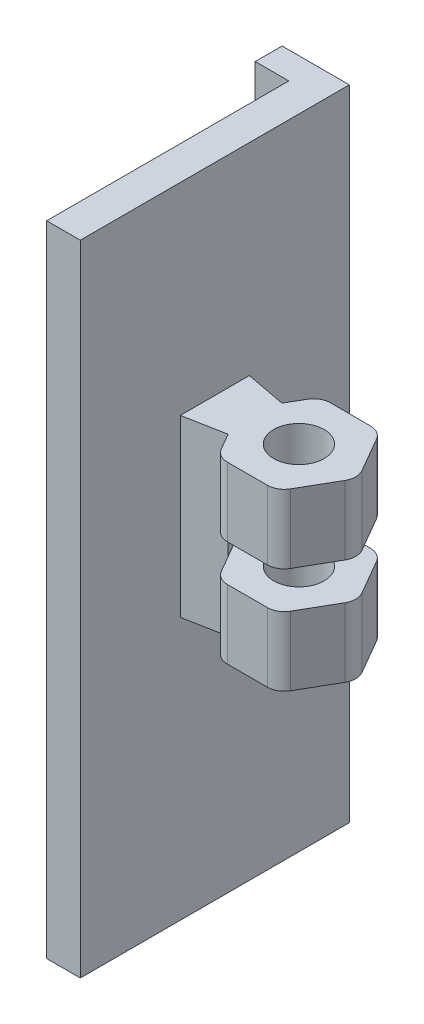
ISO-10303-21;
HEADER;
FILE_DESCRIPTION(('STEP AP214'),'2;1');
FILE_NAME('part.step','',(''),(''),'','','');
FILE_SCHEMA(('AUTOMOTIVE_DESIGN { 1 0 10303 214 1 1 1 1 }'));
ENDSEC;
DATA;
#1=APPLICATION_CONTEXT('core data for automotive mechanical design processes');
#2=APPLICATION_PROTOCOL_DEFINITION('international standard','automotive_design',2000,#1);
#3=PRODUCT_CONTEXT('',#1,'mechanical');
#4=PRODUCT('Part','Part','',(#3));
#5=PRODUCT_RELATED_PRODUCT_CATEGORY('part','',(#4));
#6=PRODUCT_DEFINITION_FORMATION('','',#4);
#7=PRODUCT_DEFINITION_CONTEXT('part definition',#1,'design');
#8=PRODUCT_DEFINITION('design','',#6,#7);
#9=PRODUCT_DEFINITION_SHAPE('','',#8);
#10=(LENGTH_UNIT() NAMED_UNIT(*) SI_UNIT(.MILLI.,.METRE.));
#11=(NAMED_UNIT(*) PLANE_ANGLE_UNIT() SI_UNIT($,.RADIAN.));
#12=(NAMED_UNIT(*) SI_UNIT($,.STERADIAN.) SOLID_ANGLE_UNIT());
#13=UNCERTAINTY_MEASURE_WITH_UNIT(LENGTH_MEASURE(1.E-05),#10,'distance_accuracy_value','');
#14=(GEOMETRIC_REPRESENTATION_CONTEXT(3) GLOBAL_UNCERTAINTY_ASSIGNED_CONTEXT((#13)) GLOBAL_UNIT_ASSIGNED_CONTEXT((#10,
#11,#12)) REPRESENTATION_CONTEXT('',''));
#15=CARTESIAN_POINT('',(0.,0.,0.));
#16=DIRECTION('',(0.,0.,1.));
#17=DIRECTION('',(1.,0.,0.));
#18=AXIS2_PLACEMENT_3D('',#15,#16,#17);
#19=CARTESIAN_POINT('',(2.05832704406993,-7.65,0.765));
#20=DIRECTION('',(0.866025403784441,0.,-0.499999999999996));
#21=DIRECTION('',(-0.499999999999996,0.,-0.866025403784441));
#22=AXIS2_PLACEMENT_3D('',#19,#20,#21);
#23=PLANE('',#22);
#24=DIRECTION('',(0.500000000000008,0.,0.866025403784434));
#25=VECTOR('',#24,1.);
#26=CARTESIAN_POINT('',(2.05832704406993,-8.675,0.765));
#27=LINE('',#26,#25);
#28=CARTESIAN_POINT('',(1.84759419581571,-8.675,0.399999999999999));
#29=VERTEX_POINT('',#28);
#30=CARTESIAN_POINT('',(1.98615826042123,-8.675,0.640000000000003));
#31=VERTEX_POINT('',#30);
#32=EDGE_CURVE('E300',#29,#31,#27,.T.);
#33=ORIENTED_EDGE('',*,*,#32,.T.);
#34=DIRECTION('',(0.,-1.,0.));
#35=VECTOR('',#34,1.);
#36=CARTESIAN_POINT('',(1.98615826042123,-7.65,0.639999999999999));
#37=LINE('',#36,#35);
#38=CARTESIAN_POINT('',(1.98615826042123,-7.65,0.639999999999999));
#39=VERTEX_POINT('',#38);
#40=EDGE_CURVE('E491',#31,#39,#37,.F.);
#41=ORIENTED_EDGE('',*,*,#40,.T.);
#42=DIRECTION('',(0.499999999999996,0.,0.866025403784441));
#43=VECTOR('',#42,1.);
#44=CARTESIAN_POINT('',(2.05832704406993,-7.65,0.765));
#45=LINE('',#44,#43);
#46=CARTESIAN_POINT('',(1.84759419581572,-7.65,0.399999999999996));
#47=VERTEX_POINT('',#46);
#48=EDGE_CURVE('E392',#47,#39,#45,.T.);
#49=ORIENTED_EDGE('',*,*,#48,.F.);
#50=DIRECTION('',(0.,-1.,0.));
#51=VECTOR('',#50,1.);
#52=CARTESIAN_POINT('',(1.84759419581572,-7.65,0.399999999999996));
#53=LINE('',#52,#51);
#54=EDGE_CURVE('E435',#47,#29,#53,.T.);
#55=ORIENTED_EDGE('',*,*,#54,.T.);
#56=EDGE_LOOP('',(#33,#41,#49,#55));
#57=FACE_BOUND('',#56,.T.);
#58=ADVANCED_FACE('F33',(#57),#23,.F.);
#59=CARTESIAN_POINT('',(2.94167295593006,-7.65,0.765000000000004));
#60=DIRECTION('',(0.,0.,-1.));
#61=DIRECTION('',(-1.,0.,0.));
#62=AXIS2_PLACEMENT_3D('',#59,#60,#61);
#63=PLANE('',#62);
#64=DIRECTION('',(1.,0.,0.));
#65=VECTOR('',#64,1.);
#66=CARTESIAN_POINT('',(2.05832704406993,-8.675,0.765));
#67=LINE('',#66,#65);
#68=CARTESIAN_POINT('',(2.20266461136734,-8.675,0.765));
#69=VERTEX_POINT('',#68);
#70=CARTESIAN_POINT('',(2.79733538863265,-8.675,0.765000000000001));
#71=VERTEX_POINT('',#70);
#72=EDGE_CURVE('E304',#69,#71,#67,.T.);
#73=ORIENTED_EDGE('',*,*,#72,.T.);
#74=DIRECTION('',(0.,-1.,0.));
#75=VECTOR('',#74,1.);
#76=CARTESIAN_POINT('',(2.79733538863265,-7.65,0.765000000000003));
#77=LINE('',#76,#75);
#78=CARTESIAN_POINT('',(2.79733538863265,-7.65,0.765000000000003));
#79=VERTEX_POINT('',#78);
#80=EDGE_CURVE('E483',#71,#79,#77,.F.);
#81=ORIENTED_EDGE('',*,*,#80,.T.);
#82=DIRECTION('',(1.,0.,0.));
#83=VECTOR('',#82,1.);
#84=CARTESIAN_POINT('',(2.94167295593006,-7.65,0.765000000000004));
#85=LINE('',#84,#83);
#86=CARTESIAN_POINT('',(2.20266461136734,-7.65,0.765));
#87=VERTEX_POINT('',#86);
#88=EDGE_CURVE('E395',#87,#79,#85,.T.);
#89=ORIENTED_EDGE('',*,*,#88,.F.);
#90=DIRECTION('',(0.,-1.,0.));
#91=VECTOR('',#90,1.);
#92=CARTESIAN_POINT('',(2.20266461136734,-7.65,0.765));
#93=LINE('',#92,#91);
#94=EDGE_CURVE('E488',#87,#69,#93,.T.);
#95=ORIENTED_EDGE('',*,*,#94,.T.);
#96=EDGE_LOOP('',(#73,#81,#89,#95));
#97=FACE_BOUND('',#96,.T.);
#98=ADVANCED_FACE('F583',(#97),#63,.F.);
#99=CARTESIAN_POINT('',(3.38334591186012,-7.65,0.));
#100=DIRECTION('',(-0.866025403784438,0.,-0.500000000000001));
#101=DIRECTION('',(-0.500000000000001,0.,0.866025403784438));
#102=AXIS2_PLACEMENT_3D('',#99,#100,#101);
#103=PLANE('',#102);
#104=DIRECTION('',(0.500000000000002,0.,-0.866025403784438));
#105=VECTOR('',#104,1.);
#106=CARTESIAN_POINT('',(2.94167295593006,-8.675,0.765000000000001));
#107=LINE('',#106,#105);
#108=CARTESIAN_POINT('',(3.01384173957876,-8.675,0.640000000000003));
#109=VERTEX_POINT('',#108);
#110=CARTESIAN_POINT('',(3.31117712821142,-8.675,0.125000000000002));
#111=VERTEX_POINT('',#110);
#112=EDGE_CURVE('E288',#109,#111,#107,.T.);
#113=ORIENTED_EDGE('',*,*,#112,.T.);
#114=DIRECTION('',(0.,-1.,0.));
#115=VECTOR('',#114,1.);
#116=CARTESIAN_POINT('',(3.31117712821142,-7.65,0.125000000000002));
#117=LINE('',#116,#115);
#118=CARTESIAN_POINT('',(3.31117712821142,-7.65,0.125000000000002));
#119=VERTEX_POINT('',#118);
#120=EDGE_CURVE('E502',#111,#119,#117,.F.);
#121=ORIENTED_EDGE('',*,*,#120,.T.);
#122=DIRECTION('',(0.500000000000001,0.,-0.866025403784438));
#123=VECTOR('',#122,1.);
#124=CARTESIAN_POINT('',(3.38334591186012,-7.65,0.));
#125=LINE('',#124,#123);
#126=CARTESIAN_POINT('',(3.01384173957876,-7.65,0.640000000000003));
#127=VERTEX_POINT('',#126);
#128=EDGE_CURVE('E398',#127,#119,#125,.T.);
#129=ORIENTED_EDGE('',*,*,#128,.F.);
#130=DIRECTION('',(0.,-1.,0.));
#131=VECTOR('',#130,1.);
#132=CARTESIAN_POINT('',(3.01384173957876,-7.65,0.640000000000003));
#133=LINE('',#132,#131);
#134=EDGE_CURVE('E507',#127,#109,#133,.T.);
#135=ORIENTED_EDGE('',*,*,#134,.T.);
#136=EDGE_LOOP('',(#113,#121,#129,#135));
#137=FACE_BOUND('',#136,.T.);
#138=ADVANCED_FACE('F575',(#137),#103,.F.);
#139=CARTESIAN_POINT('',(2.94167295593006,-7.65,-0.764999999999999));
#140=DIRECTION('',(-0.866025403784441,0.,0.499999999999996));
#141=DIRECTION('',(0.499999999999996,0.,0.866025403784441));
#142=AXIS2_PLACEMENT_3D('',#139,#140,#141);
#143=PLANE('',#142);
#144=DIRECTION('',(-0.499999999999997,0.,-0.86602540378444));
#145=VECTOR('',#144,1.);
#146=CARTESIAN_POINT('',(3.38334591186012,-8.675,0.));
#147=LINE('',#146,#145);
#148=CARTESIAN_POINT('',(3.31117712821142,-8.675,-0.124999999999997));
#149=VERTEX_POINT('',#148);
#150=CARTESIAN_POINT('',(3.01384173957876,-8.675,-0.639999999999998));
#151=VERTEX_POINT('',#150);
#152=EDGE_CURVE('E291',#149,#151,#147,.T.);
#153=ORIENTED_EDGE('',*,*,#152,.T.);
#154=DIRECTION('',(0.,-1.,0.));
#155=VECTOR('',#154,1.);
#156=CARTESIAN_POINT('',(3.01384173957876,-7.65,-0.639999999999998));
#157=LINE('',#156,#155);
#158=CARTESIAN_POINT('',(3.01384173957876,-7.65,-0.639999999999998));
#159=VERTEX_POINT('',#158);
#160=EDGE_CURVE('E56',#151,#159,#157,.F.);
#161=ORIENTED_EDGE('',*,*,#160,.T.);
#162=DIRECTION('',(-0.499999999999996,0.,-0.866025403784441));
#163=VECTOR('',#162,1.);
#164=CARTESIAN_POINT('',(2.94167295593006,-7.65,-0.764999999999999));
#165=LINE('',#164,#163);
#166=CARTESIAN_POINT('',(3.31117712821142,-7.65,-0.124999999999997));
#167=VERTEX_POINT('',#166);
#168=EDGE_CURVE('E401',#167,#159,#165,.T.);
#169=ORIENTED_EDGE('',*,*,#168,.F.);
#170=DIRECTION('',(0.,-1.,0.));
#171=VECTOR('',#170,1.);
#172=CARTESIAN_POINT('',(3.31117712821142,-7.65,-0.124999999999997));
#173=LINE('',#172,#171);
#174=EDGE_CURVE('E496',#167,#149,#173,.T.);
#175=ORIENTED_EDGE('',*,*,#174,.T.);
#176=EDGE_LOOP('',(#153,#161,#169,#175));
#177=FACE_BOUND('',#176,.T.);
#178=ADVANCED_FACE('F568',(#177),#143,.F.);
#179=CARTESIAN_POINT('',(2.05832704406993,-7.65,-0.765));
#180=DIRECTION('',(0.,0.,1.));
#181=DIRECTION('',(1.,0.,0.));
#182=AXIS2_PLACEMENT_3D('',#179,#180,#181);
#183=PLANE('',#182);
#184=DIRECTION('',(-1.,0.,0.));
#185=VECTOR('',#184,1.);
#186=CARTESIAN_POINT('',(2.94167295593006,-8.675,-0.764999999999996));
#187=LINE('',#186,#185);
#188=CARTESIAN_POINT('',(2.79733538863266,-8.675,-0.764999999999997));
#189=VERTEX_POINT('',#188);
#190=CARTESIAN_POINT('',(2.20266461136734,-8.675,-0.765));
#191=VERTEX_POINT('',#190);
#192=EDGE_CURVE('E293',#189,#191,#187,.T.);
#193=ORIENTED_EDGE('',*,*,#192,.T.);
#194=DIRECTION('',(0.,-1.,0.));
#195=VECTOR('',#194,1.);
#196=CARTESIAN_POINT('',(2.20266461136734,-7.65,-0.765));
#197=LINE('',#196,#195);
#198=CARTESIAN_POINT('',(2.20266461136734,-7.65,-0.765));
#199=VERTEX_POINT('',#198);
#200=EDGE_CURVE('E469',#191,#199,#197,.F.);
#201=ORIENTED_EDGE('',*,*,#200,.T.);
#202=DIRECTION('',(-1.,0.,0.));
#203=VECTOR('',#202,1.);
#204=CARTESIAN_POINT('',(2.05832704406993,-7.65,-0.765));
#205=LINE('',#204,#203);
#206=CARTESIAN_POINT('',(2.79733538863265,-7.65,-0.764999999999999));
#207=VERTEX_POINT('',#206);
#208=EDGE_CURVE('E403',#207,#199,#205,.T.);
#209=ORIENTED_EDGE('',*,*,#208,.F.);
#210=DIRECTION('',(0.,-1.,0.));
#211=VECTOR('',#210,1.);
#212=CARTESIAN_POINT('',(2.79733538863265,-7.65,-0.764999999999999));
#213=LINE('',#212,#211);
#214=EDGE_CURVE('E466',#207,#189,#213,.T.);
#215=ORIENTED_EDGE('',*,*,#214,.T.);
#216=EDGE_LOOP('',(#193,#201,#209,#215));
#217=FACE_BOUND('',#216,.T.);
#218=ADVANCED_FACE('F562',(#217),#183,.F.);
#219=CARTESIAN_POINT('',(1.84759419581572,-7.65,-0.400000000000004));
#220=DIRECTION('',(0.866025403784441,0.,0.499999999999996));
#221=DIRECTION('',(0.499999999999996,0.,-0.866025403784441));
#222=AXIS2_PLACEMENT_3D('',#219,#220,#221);
#223=PLANE('',#222);
#224=DIRECTION('',(-0.500000000000003,0.,0.866025403784437));
#225=VECTOR('',#224,1.);
#226=CARTESIAN_POINT('',(1.66665408813986,-8.675,-0.0866025403784418));
#227=LINE('',#226,#225);
#228=CARTESIAN_POINT('',(1.98615826042123,-8.675,-0.640000000000002));
#229=VERTEX_POINT('',#228);
#230=CARTESIAN_POINT('',(1.84759419581572,-8.675,-0.400000000000006));
#231=VERTEX_POINT('',#230);
#232=EDGE_CURVE('E297',#229,#231,#227,.T.);
#233=ORIENTED_EDGE('',*,*,#232,.T.);
#234=DIRECTION('',(0.,-1.,0.));
#235=VECTOR('',#234,1.);
#236=CARTESIAN_POINT('',(1.84759419581572,-7.65,-0.400000000000004));
#237=LINE('',#236,#235);
#238=CARTESIAN_POINT('',(1.84759419581572,-7.65,-0.400000000000004));
#239=VERTEX_POINT('',#238);
#240=EDGE_CURVE('E431',#239,#231,#237,.T.);
#241=ORIENTED_EDGE('',*,*,#240,.F.);
#242=DIRECTION('',(-0.499999999999996,0.,0.866025403784441));
#243=VECTOR('',#242,1.);
#244=CARTESIAN_POINT('',(1.84759419581572,-7.65,-0.400000000000004));
#245=LINE('',#244,#243);
#246=CARTESIAN_POINT('',(1.98615826042123,-7.65,-0.639999999999999));
#247=VERTEX_POINT('',#246);
#248=EDGE_CURVE('E406',#247,#239,#245,.T.);
#249=ORIENTED_EDGE('',*,*,#248,.F.);
#250=DIRECTION('',(0.,-1.,0.));
#251=VECTOR('',#250,1.);
#252=CARTESIAN_POINT('',(1.98615826042123,-7.65,-0.639999999999999));
#253=LINE('',#252,#251);
#254=EDGE_CURVE('E452',#247,#229,#253,.T.);
#255=ORIENTED_EDGE('',*,*,#254,.T.);
#256=EDGE_LOOP('',(#233,#241,#249,#255));
#257=FACE_BOUND('',#256,.T.);
#258=ADVANCED_FACE('F554',(#257),#223,.F.);
#259=CARTESIAN_POINT('',(2.5,-7.65,0.));
#260=DIRECTION('',(0.,-1.,0.));
#261=DIRECTION('',(1.,0.,0.));
#262=AXIS2_PLACEMENT_3D('',#259,#260,#261);
#263=CYLINDRICAL_SURFACE('',#262,0.375);
#264=CARTESIAN_POINT('',(2.5,-7.65,0.));
#265=DIRECTION('',(0.,1.,0.));
#266=DIRECTION('',(-1.,0.,0.));
#267=AXIS2_PLACEMENT_3D('',#264,#265,#266);
#268=CIRCLE('',#267,0.375);
#269=CARTESIAN_POINT('',(2.125,-7.65,0.));
#270=VERTEX_POINT('',#269);
#271=EDGE_CURVE('E381',#270,#270,#268,.T.);
#272=ORIENTED_EDGE('',*,*,#271,.T.);
#273=EDGE_LOOP('',(#272));
#274=FACE_BOUND('',#273,.T.);
#275=CARTESIAN_POINT('',(2.5,-8.675,0.));
#276=DIRECTION('',(0.,-1.,0.));
#277=DIRECTION('',(1.,0.,0.));
#278=AXIS2_PLACEMENT_3D('',#275,#276,#277);
#279=CIRCLE('',#278,0.375);
#280=CARTESIAN_POINT('',(2.875,-8.675,0.));
#281=VERTEX_POINT('',#280);
#282=EDGE_CURVE('E330',#281,#281,#279,.T.);
#283=ORIENTED_EDGE('',*,*,#282,.T.);
#284=EDGE_LOOP('',(#283));
#285=FACE_BOUND('',#284,.T.);
#286=ADVANCED_FACE('F637',(#274,#285),#263,.F.);
#287=CARTESIAN_POINT('',(2.20266461136734,-7.65,-0.515));
#288=DIRECTION('',(0.,-1.,0.));
#289=DIRECTION('',(1.,0.,0.));
#290=AXIS2_PLACEMENT_3D('',#287,#288,#289);
#291=CYLINDRICAL_SURFACE('',#290,0.25);
#292=ORIENTED_EDGE('',*,*,#200,.F.);
#293=CARTESIAN_POINT('',(2.20266461136734,-8.675,-0.515));
#294=DIRECTION('',(0.,-1.,0.));
#295=DIRECTION('',(1.,0.,0.));
#296=AXIS2_PLACEMENT_3D('',#293,#294,#295);
#297=CIRCLE('',#296,0.25);
#298=EDGE_CURVE('E327',#191,#229,#297,.F.);
#299=ORIENTED_EDGE('',*,*,#298,.T.);
#300=ORIENTED_EDGE('',*,*,#254,.F.);
#301=CARTESIAN_POINT('',(2.20266461136734,-7.65,-0.515));
#302=DIRECTION('',(0.,-1.,0.));
#303=DIRECTION('',(0.,0.,-1.));
#304=AXIS2_PLACEMENT_3D('',#301,#302,#303);
#305=CIRCLE('',#304,0.25);
#306=EDGE_CURVE('E481',#199,#247,#305,.F.);
#307=ORIENTED_EDGE('',*,*,#306,.F.);
#308=EDGE_LOOP('',(#292,#299,#300,#307));
#309=FACE_BOUND('',#308,.T.);
#310=ADVANCED_FACE('F560',(#309),#291,.T.);
#311=CARTESIAN_POINT('',(2.20266461136734,-7.65,0.515));
#312=DIRECTION('',(0.,-1.,0.));
#313=DIRECTION('',(1.,0.,0.));
#314=AXIS2_PLACEMENT_3D('',#311,#312,#313);
#315=CYLINDRICAL_SURFACE('',#314,0.25);
#316=ORIENTED_EDGE('',*,*,#40,.F.);
#317=CARTESIAN_POINT('',(2.20266461136734,-8.675,0.515));
#318=DIRECTION('',(0.,-1.,0.));
#319=DIRECTION('',(1.,0.,0.));
#320=AXIS2_PLACEMENT_3D('',#317,#318,#319);
#321=CIRCLE('',#320,0.25);
#322=EDGE_CURVE('E324',#31,#69,#321,.F.);
#323=ORIENTED_EDGE('',*,*,#322,.T.);
#324=ORIENTED_EDGE('',*,*,#94,.F.);
#325=CARTESIAN_POINT('',(2.20266461136734,-7.65,0.515));
#326=DIRECTION('',(0.,-1.,0.));
#327=DIRECTION('',(0.,0.,-1.));
#328=AXIS2_PLACEMENT_3D('',#325,#326,#327);
#329=CIRCLE('',#328,0.25);
#330=EDGE_CURVE('E479',#39,#87,#329,.F.);
#331=ORIENTED_EDGE('',*,*,#330,.F.);
#332=EDGE_LOOP('',(#316,#323,#324,#331));
#333=FACE_BOUND('',#332,.T.);
#334=ADVANCED_FACE('F589',(#333),#315,.T.);
#335=CARTESIAN_POINT('',(2.79733538863265,-7.65,-0.514999999999999));
#336=DIRECTION('',(0.,-1.,0.));
#337=DIRECTION('',(1.,0.,0.));
#338=AXIS2_PLACEMENT_3D('',#335,#336,#337);
#339=CYLINDRICAL_SURFACE('',#338,0.25);
#340=ORIENTED_EDGE('',*,*,#160,.F.);
#341=CARTESIAN_POINT('',(2.79733538863265,-8.675,-0.514999999999999));
#342=DIRECTION('',(0.,-1.,0.));
#343=DIRECTION('',(1.,0.,0.));
#344=AXIS2_PLACEMENT_3D('',#341,#342,#343);
#345=CIRCLE('',#344,0.25);
#346=EDGE_CURVE('E321',#151,#189,#345,.F.);
#347=ORIENTED_EDGE('',*,*,#346,.T.);
#348=ORIENTED_EDGE('',*,*,#214,.F.);
#349=CARTESIAN_POINT('',(2.79733538863265,-7.65,-0.514999999999999));
#350=DIRECTION('',(0.,-1.,0.));
#351=DIRECTION('',(0.,0.,-1.));
#352=AXIS2_PLACEMENT_3D('',#349,#350,#351);
#353=CIRCLE('',#352,0.25);
#354=EDGE_CURVE('E477',#159,#207,#353,.F.);
#355=ORIENTED_EDGE('',*,*,#354,.F.);
#356=EDGE_LOOP('',(#340,#347,#348,#355));
#357=FACE_BOUND('',#356,.T.);
#358=ADVANCED_FACE('F567',(#357),#339,.T.);
#359=CARTESIAN_POINT('',(2.79733538863265,-7.65,0.515000000000003));
#360=DIRECTION('',(0.,-1.,0.));
#361=DIRECTION('',(1.,0.,0.));
#362=AXIS2_PLACEMENT_3D('',#359,#360,#361);
#363=CYLINDRICAL_SURFACE('',#362,0.25);
#364=ORIENTED_EDGE('',*,*,#80,.F.);
#365=CARTESIAN_POINT('',(2.79733538863265,-8.675,0.515000000000003));
#366=DIRECTION('',(0.,-1.,0.));
#367=DIRECTION('',(1.,0.,0.));
#368=AXIS2_PLACEMENT_3D('',#365,#366,#367);
#369=CIRCLE('',#368,0.25);
#370=EDGE_CURVE('E318',#71,#109,#369,.F.);
#371=ORIENTED_EDGE('',*,*,#370,.T.);
#372=ORIENTED_EDGE('',*,*,#134,.F.);
#373=CARTESIAN_POINT('',(2.79733538863265,-7.65,0.515000000000003));
#374=DIRECTION('',(0.,-1.,0.));
#375=DIRECTION('',(0.,0.,-1.));
#376=AXIS2_PLACEMENT_3D('',#373,#374,#375);
#377=CIRCLE('',#376,0.25);
#378=EDGE_CURVE('E475',#79,#127,#377,.F.);
#379=ORIENTED_EDGE('',*,*,#378,.F.);
#380=EDGE_LOOP('',(#364,#371,#372,#379));
#381=FACE_BOUND('',#380,.T.);
#382=ADVANCED_FACE('F581',(#381),#363,.T.);
#383=CARTESIAN_POINT('',(3.09467077726531,-7.65,0.));
#384=DIRECTION('',(0.,-1.,0.));
#385=DIRECTION('',(1.,0.,0.));
#386=AXIS2_PLACEMENT_3D('',#383,#384,#385);
#387=CYLINDRICAL_SURFACE('',#386,0.25);
#388=ORIENTED_EDGE('',*,*,#120,.F.);
#389=CARTESIAN_POINT('',(3.09467077726531,-8.675,0.));
#390=DIRECTION('',(0.,-1.,0.));
#391=DIRECTION('',(1.,0.,0.));
#392=AXIS2_PLACEMENT_3D('',#389,#390,#391);
#393=CIRCLE('',#392,0.25);
#394=EDGE_CURVE('E11',#111,#149,#393,.F.);
#395=ORIENTED_EDGE('',*,*,#394,.T.);
#396=ORIENTED_EDGE('',*,*,#174,.F.);
#397=CARTESIAN_POINT('',(3.09467077726531,-7.65,0.));
#398=DIRECTION('',(0.,-1.,0.));
#399=DIRECTION('',(0.,0.,-1.));
#400=AXIS2_PLACEMENT_3D('',#397,#398,#399);
#401=CIRCLE('',#400,0.25);
#402=EDGE_CURVE('E473',#119,#167,#401,.F.);
#403=ORIENTED_EDGE('',*,*,#402,.F.);
#404=EDGE_LOOP('',(#388,#395,#396,#403));
#405=FACE_BOUND('',#404,.T.);
#406=ADVANCED_FACE('F573',(#405),#387,.T.);
#407=CARTESIAN_POINT('',(0.750000000000002,-7.65,2.));
#408=DIRECTION('',(1.,0.,0.));
#409=DIRECTION('',(0.,1.,0.));
#410=AXIS2_PLACEMENT_3D('',#407,#408,#409);
#411=PLANE('',#410);
#412=DIRECTION('',(0.,1.,0.));
#413=VECTOR('',#412,1.);
#414=CARTESIAN_POINT('',(0.750000000000006,-4.65,-1.60000000000001));
#415=LINE('',#414,#413);
#416=CARTESIAN_POINT('',(0.750000000000005,-14.15,-1.6));
#417=VERTEX_POINT('',#416);
#418=CARTESIAN_POINT('',(0.750000000000006,-4.65,-1.60000000000001));
#419=VERTEX_POINT('',#418);
#420=EDGE_CURVE('E337',#417,#419,#415,.T.);
#421=ORIENTED_EDGE('',*,*,#420,.F.);
#422=DIRECTION('',(0.,0.,1.));
#423=VECTOR('',#422,1.);
#424=CARTESIAN_POINT('',(0.750000000000006,-14.15,-2.));
#425=LINE('',#424,#423);
#426=CARTESIAN_POINT('',(0.749999999999996,-14.15,2.));
#427=VERTEX_POINT('',#426);
#428=EDGE_CURVE('E361',#417,#427,#425,.T.);
#429=ORIENTED_EDGE('',*,*,#428,.T.);
#430=DIRECTION('',(0.,-1.,0.));
#431=VECTOR('',#430,1.);
#432=CARTESIAN_POINT('',(0.750000000000002,-7.65,2.));
#433=LINE('',#432,#431);
#434=CARTESIAN_POINT('',(0.749999999999997,-4.65,2.));
#435=VERTEX_POINT('',#434);
#436=EDGE_CURVE('E443',#435,#427,#433,.T.);
#437=ORIENTED_EDGE('',*,*,#436,.F.);
#438=DIRECTION('',(0.,0.,1.));
#439=VECTOR('',#438,1.);
#440=CARTESIAN_POINT('',(0.750000000000007,-4.65,-2.00000000000001));
#441=LINE('',#440,#439);
#442=EDGE_CURVE('E356',#419,#435,#441,.T.);
#443=ORIENTED_EDGE('',*,*,#442,.F.);
#444=EDGE_LOOP('',(#421,#429,#437,#443));
#445=FACE_BOUND('',#444,.T.);
#446=ADVANCED_FACE('F633',(#445),#411,.F.);
#447=CARTESIAN_POINT('',(0.,-7.65,0.));
#448=DIRECTION('',(0.,-1.,0.));
#449=DIRECTION('',(0.,0.,-1.));
#450=AXIS2_PLACEMENT_3D('',#447,#448,#449);
#451=PLANE('',#450);
#452=ORIENTED_EDGE('',*,*,#208,.T.);
#453=ORIENTED_EDGE('',*,*,#306,.T.);
#454=ORIENTED_EDGE('',*,*,#248,.T.);
#455=DIRECTION('',(-0.982526008207234,0.,-0.186125342703131));
#456=VECTOR('',#455,1.);
#457=CARTESIAN_POINT('',(1.25,-7.65,-0.51320557783153));
#458=LINE('',#457,#456);
#459=CARTESIAN_POINT('',(1.25,-7.65,-0.51320557783153));
#460=VERTEX_POINT('',#459);
#461=EDGE_CURVE('E387',#239,#460,#458,.T.);
#462=ORIENTED_EDGE('',*,*,#461,.T.);
#463=DIRECTION('',(0.,0.,1.));
#464=VECTOR('',#463,1.);
#465=CARTESIAN_POINT('',(1.25,-7.65,0.));
#466=LINE('',#465,#464);
#467=CARTESIAN_POINT('',(1.25,-7.65,0.513205577831531));
#468=VERTEX_POINT('',#467);
#469=EDGE_CURVE('E378',#460,#468,#466,.T.);
#470=ORIENTED_EDGE('',*,*,#469,.T.);
#471=DIRECTION('',(0.982526008207231,0.,-0.186125342703146));
#472=VECTOR('',#471,1.);
#473=CARTESIAN_POINT('',(1.84759419581572,-7.65,0.399999999999996));
#474=LINE('',#473,#472);
#475=EDGE_CURVE('E389',#468,#47,#474,.T.);
#476=ORIENTED_EDGE('',*,*,#475,.T.);
#477=ORIENTED_EDGE('',*,*,#48,.T.);
#478=ORIENTED_EDGE('',*,*,#330,.T.);
#479=ORIENTED_EDGE('',*,*,#88,.T.);
#480=ORIENTED_EDGE('',*,*,#378,.T.);
#481=ORIENTED_EDGE('',*,*,#128,.T.);
#482=ORIENTED_EDGE('',*,*,#402,.T.);
#483=ORIENTED_EDGE('',*,*,#168,.T.);
#484=ORIENTED_EDGE('',*,*,#354,.T.);
#485=EDGE_LOOP('',(#452,#453,#454,#462,#470,#476,#477,#478,#479,#480,#481,#482,#483,#484));
#486=FACE_BOUND('',#485,.T.);
#487=ORIENTED_EDGE('',*,*,#271,.F.);
#488=EDGE_LOOP('',(#487));
#489=FACE_BOUND('',#488,.T.);
#490=ADVANCED_FACE('F630',(#486,#489),#451,.F.);
#491=CARTESIAN_POINT('',(0.,-10.25,0.));
#492=DIRECTION('',(0.,-1.,0.));
#493=DIRECTION('',(0.,0.,-1.));
#494=AXIS2_PLACEMENT_3D('',#491,#492,#493);
#495=PLANE('',#494);
#496=DIRECTION('',(-0.499999999999996,0.,0.866025403784441));
#497=VECTOR('',#496,1.);
#498=CARTESIAN_POINT('',(1.84759419581572,-10.25,-0.400000000000004));
#499=LINE('',#498,#497);
#500=CARTESIAN_POINT('',(1.98615826042123,-10.25,-0.639999999999999));
#501=VERTEX_POINT('',#500);
#502=CARTESIAN_POINT('',(1.84759419581572,-10.25,-0.400000000000004));
#503=VERTEX_POINT('',#502);
#504=EDGE_CURVE('E390',#501,#503,#499,.T.);
#505=ORIENTED_EDGE('',*,*,#504,.F.);
#506=CARTESIAN_POINT('',(2.20266461136734,-10.25,-0.515));
#507=DIRECTION('',(0.,-1.,0.));
#508=DIRECTION('',(0.,0.,-1.));
#509=AXIS2_PLACEMENT_3D('',#506,#507,#508);
#510=CIRCLE('',#509,0.25);
#511=CARTESIAN_POINT('',(2.20266461136734,-10.25,-0.765));
#512=VERTEX_POINT('',#511);
#513=EDGE_CURVE('E463',#501,#512,#510,.T.);
#514=ORIENTED_EDGE('',*,*,#513,.T.);
#515=DIRECTION('',(-1.,0.,0.));
#516=VECTOR('',#515,1.);
#517=CARTESIAN_POINT('',(2.05832704406993,-10.25,-0.765));
#518=LINE('',#517,#516);
#519=CARTESIAN_POINT('',(2.79733538863265,-10.25,-0.764999999999999));
#520=VERTEX_POINT('',#519);
#521=EDGE_CURVE('E426',#520,#512,#518,.T.);
#522=ORIENTED_EDGE('',*,*,#521,.F.);
#523=CARTESIAN_POINT('',(2.79733538863265,-10.25,-0.514999999999999));
#524=DIRECTION('',(0.,-1.,0.));
#525=DIRECTION('',(0.,0.,-1.));
#526=AXIS2_PLACEMENT_3D('',#523,#524,#525);
#527=CIRCLE('',#526,0.25);
#528=CARTESIAN_POINT('',(3.01384173957876,-10.25,-0.639999999999998));
#529=VERTEX_POINT('',#528);
#530=EDGE_CURVE('E459',#520,#529,#527,.T.);
#531=ORIENTED_EDGE('',*,*,#530,.T.);
#532=DIRECTION('',(-0.499999999999996,0.,-0.866025403784441));
#533=VECTOR('',#532,1.);
#534=CARTESIAN_POINT('',(2.94167295593006,-10.25,-0.764999999999999));
#535=LINE('',#534,#533);
#536=CARTESIAN_POINT('',(3.31117712821142,-10.25,-0.124999999999997));
#537=VERTEX_POINT('',#536);
#538=EDGE_CURVE('E423',#537,#529,#535,.T.);
#539=ORIENTED_EDGE('',*,*,#538,.F.);
#540=CARTESIAN_POINT('',(3.09467077726531,-10.25,0.));
#541=DIRECTION('',(0.,-1.,0.));
#542=DIRECTION('',(0.,0.,-1.));
#543=AXIS2_PLACEMENT_3D('',#540,#541,#542);
#544=CIRCLE('',#543,0.25);
#545=CARTESIAN_POINT('',(3.31117712821142,-10.25,0.125000000000002));
#546=VERTEX_POINT('',#545);
#547=EDGE_CURVE('E455',#537,#546,#544,.T.);
#548=ORIENTED_EDGE('',*,*,#547,.T.);
#549=DIRECTION('',(0.500000000000001,0.,-0.866025403784438));
#550=VECTOR('',#549,1.);
#551=CARTESIAN_POINT('',(3.38334591186012,-10.25,0.));
#552=LINE('',#551,#550);
#553=CARTESIAN_POINT('',(3.01384173957876,-10.25,0.640000000000003));
#554=VERTEX_POINT('',#553);
#555=EDGE_CURVE('E420',#554,#546,#552,.T.);
#556=ORIENTED_EDGE('',*,*,#555,.F.);
#557=CARTESIAN_POINT('',(2.79733538863265,-10.25,0.515000000000003));
#558=DIRECTION('',(0.,-1.,0.));
#559=DIRECTION('',(0.,0.,-1.));
#560=AXIS2_PLACEMENT_3D('',#557,#558,#559);
#561=CIRCLE('',#560,0.25);
#562=CARTESIAN_POINT('',(2.79733538863265,-10.25,0.765000000000003));
#563=VERTEX_POINT('',#562);
#564=EDGE_CURVE('E457',#554,#563,#561,.T.);
#565=ORIENTED_EDGE('',*,*,#564,.T.);
#566=DIRECTION('',(1.,0.,0.));
#567=VECTOR('',#566,1.);
#568=CARTESIAN_POINT('',(2.94167295593006,-10.25,0.765000000000004));
#569=LINE('',#568,#567);
#570=CARTESIAN_POINT('',(2.20266461136734,-10.25,0.765));
#571=VERTEX_POINT('',#570);
#572=EDGE_CURVE('E417',#571,#563,#569,.T.);
#573=ORIENTED_EDGE('',*,*,#572,.F.);
#574=CARTESIAN_POINT('',(2.20266461136734,-10.25,0.515));
#575=DIRECTION('',(0.,-1.,0.));
#576=DIRECTION('',(0.,0.,-1.));
#577=AXIS2_PLACEMENT_3D('',#574,#575,#576);
#578=CIRCLE('',#577,0.25);
#579=CARTESIAN_POINT('',(1.98615826042123,-10.25,0.639999999999999));
#580=VERTEX_POINT('',#579);
#581=EDGE_CURVE('E461',#571,#580,#578,.T.);
#582=ORIENTED_EDGE('',*,*,#581,.T.);
#583=DIRECTION('',(0.499999999999996,0.,0.866025403784441));
#584=VECTOR('',#583,1.);
#585=CARTESIAN_POINT('',(2.05832704406993,-10.25,0.765));
#586=LINE('',#585,#584);
#587=CARTESIAN_POINT('',(1.84759419581572,-10.25,0.399999999999996));
#588=VERTEX_POINT('',#587);
#589=EDGE_CURVE('E414',#588,#580,#586,.T.);
#590=ORIENTED_EDGE('',*,*,#589,.F.);
#591=DIRECTION('',(0.982526008207231,0.,-0.186125342703146));
#592=VECTOR('',#591,1.);
#593=CARTESIAN_POINT('',(1.84759419581572,-10.25,0.399999999999996));
#594=LINE('',#593,#592);
#595=CARTESIAN_POINT('',(1.25,-10.25,0.513205577831531));
#596=VERTEX_POINT('',#595);
#597=EDGE_CURVE('E411',#596,#588,#594,.T.);
#598=ORIENTED_EDGE('',*,*,#597,.F.);
#599=DIRECTION('',(0.,0.,1.));
#600=VECTOR('',#599,1.);
#601=CARTESIAN_POINT('',(1.25,-10.25,0.));
#602=LINE('',#601,#600);
#603=CARTESIAN_POINT('',(1.25,-10.25,-0.51320557783153));
#604=VERTEX_POINT('',#603);
#605=EDGE_CURVE('E376',#604,#596,#602,.T.);
#606=ORIENTED_EDGE('',*,*,#605,.F.);
#607=DIRECTION('',(-0.982526008207234,0.,-0.186125342703131));
#608=VECTOR('',#607,1.);
#609=CARTESIAN_POINT('',(1.25,-10.25,-0.51320557783153));
#610=LINE('',#609,#608);
#611=EDGE_CURVE('E384',#503,#604,#610,.T.);
#612=ORIENTED_EDGE('',*,*,#611,.F.);
#613=EDGE_LOOP('',(#505,#514,#522,#531,#539,#548,#556,#565,#573,#582,#590,#598,#606,#612));
#614=FACE_BOUND('',#613,.T.);
#615=CARTESIAN_POINT('',(2.5,-10.25,0.));
#616=DIRECTION('',(0.,1.,0.));
#617=DIRECTION('',(-1.,0.,0.));
#618=AXIS2_PLACEMENT_3D('',#615,#616,#617);
#619=CIRCLE('',#618,0.375);
#620=CARTESIAN_POINT('',(2.125,-10.25,0.));
#621=VERTEX_POINT('',#620);
#622=EDGE_CURVE('E380',#621,#621,#619,.T.);
#623=ORIENTED_EDGE('',*,*,#622,.T.);
#624=EDGE_LOOP('',(#623));
#625=FACE_BOUND('',#624,.T.);
#626=ADVANCED_FACE('F524',(#614,#625),#495,.T.);
#627=CARTESIAN_POINT('',(1.25,-7.65,-0.51320557783153));
#628=DIRECTION('',(-0.186125342703131,0.,0.982526008207234));
#629=DIRECTION('',(0.982526008207234,0.,0.186125342703131));
#630=AXIS2_PLACEMENT_3D('',#627,#628,#629);
#631=PLANE('',#630);
#632=ORIENTED_EDGE('',*,*,#611,.T.);
#633=DIRECTION('',(0.,-1.,0.));
#634=VECTOR('',#633,1.);
#635=CARTESIAN_POINT('',(1.25,-7.65,-0.51320557783153));
#636=LINE('',#635,#634);
#637=EDGE_CURVE('E448',#460,#604,#636,.T.);
#638=ORIENTED_EDGE('',*,*,#637,.F.);
#639=ORIENTED_EDGE('',*,*,#461,.F.);
#640=ORIENTED_EDGE('',*,*,#240,.T.);
#641=DIRECTION('',(0.,1.,0.));
#642=VECTOR('',#641,1.);
#643=CARTESIAN_POINT('',(1.84759419581572,-7.65,-0.400000000000005));
#644=LINE('',#643,#642);
#645=CARTESIAN_POINT('',(1.84759419581572,-9.225,-0.400000000000006));
#646=VERTEX_POINT('',#645);
#647=EDGE_CURVE('E335',#646,#231,#644,.T.);
#648=ORIENTED_EDGE('',*,*,#647,.F.);
#649=EDGE_CURVE('E408',#646,#503,#237,.T.);
#650=ORIENTED_EDGE('',*,*,#649,.T.);
#651=EDGE_LOOP('',(#632,#638,#639,#640,#648,#650));
#652=FACE_BOUND('',#651,.T.);
#653=ADVANCED_FACE('F546',(#652),#631,.F.);
#654=CARTESIAN_POINT('',(0.750000000000001,-7.65,-2.));
#655=DIRECTION('',(0.,0.,1.));
#656=DIRECTION('',(1.,0.,0.));
#657=AXIS2_PLACEMENT_3D('',#654,#655,#656);
#658=PLANE('',#657);
#659=DIRECTION('',(0.,-1.,0.));
#660=VECTOR('',#659,1.);
#661=CARTESIAN_POINT('',(1.25,-7.65,-2.));
#662=LINE('',#661,#660);
#663=CARTESIAN_POINT('',(1.25000000000001,-4.65,-2.));
#664=VERTEX_POINT('',#663);
#665=CARTESIAN_POINT('',(1.25000000000001,-14.15,-2.));
#666=VERTEX_POINT('',#665);
#667=EDGE_CURVE('E446',#664,#666,#662,.T.);
#668=ORIENTED_EDGE('',*,*,#667,.T.);
#669=DIRECTION('',(-1.,0.,0.));
#670=VECTOR('',#669,1.);
#671=CARTESIAN_POINT('',(1.25000000000001,-14.15,-2.));
#672=LINE('',#671,#670);
#673=CARTESIAN_POINT('',(0.250000000000006,-14.15,-2.00000000000001));
#674=VERTEX_POINT('',#673);
#675=EDGE_CURVE('E368',#666,#674,#672,.T.);
#676=ORIENTED_EDGE('',*,*,#675,.T.);
#677=DIRECTION('',(0.,-1.,0.));
#678=VECTOR('',#677,1.);
#679=CARTESIAN_POINT('',(0.250000000000007,-4.65,-2.00000000000001));
#680=LINE('',#679,#678);
#681=CARTESIAN_POINT('',(0.250000000000007,-4.65,-2.00000000000001));
#682=VERTEX_POINT('',#681);
#683=EDGE_CURVE('E338',#682,#674,#680,.T.);
#684=ORIENTED_EDGE('',*,*,#683,.F.);
#685=DIRECTION('',(-1.,0.,0.));
#686=VECTOR('',#685,1.);
#687=CARTESIAN_POINT('',(1.25000000000001,-4.65,-2.));
#688=LINE('',#687,#686);
#689=EDGE_CURVE('E364',#664,#682,#688,.T.);
#690=ORIENTED_EDGE('',*,*,#689,.F.);
#691=EDGE_LOOP('',(#668,#676,#684,#690));
#692=FACE_BOUND('',#691,.T.);
#693=ADVANCED_FACE('F675',(#692),#658,.F.);
#694=CARTESIAN_POINT('',(1.25,-7.65,2.));
#695=DIRECTION('',(0.,0.,-1.));
#696=DIRECTION('',(-1.,0.,0.));
#697=AXIS2_PLACEMENT_3D('',#694,#695,#696);
#698=PLANE('',#697);
#699=ORIENTED_EDGE('',*,*,#436,.T.);
#700=DIRECTION('',(-1.,0.,0.));
#701=VECTOR('',#700,1.);
#702=CARTESIAN_POINT('',(1.25,-14.15,2.));
#703=LINE('',#702,#701);
#704=CARTESIAN_POINT('',(1.25,-14.15,2.));
#705=VERTEX_POINT('',#704);
#706=EDGE_CURVE('E370',#705,#427,#703,.T.);
#707=ORIENTED_EDGE('',*,*,#706,.F.);
#708=DIRECTION('',(0.,-1.,0.));
#709=VECTOR('',#708,1.);
#710=CARTESIAN_POINT('',(1.25,-7.65,2.));
#711=LINE('',#710,#709);
#712=CARTESIAN_POINT('',(1.25,-4.65,2.));
#713=VERTEX_POINT('',#712);
#714=EDGE_CURVE('E441',#713,#705,#711,.T.);
#715=ORIENTED_EDGE('',*,*,#714,.F.);
#716=DIRECTION('',(-1.,0.,0.));
#717=VECTOR('',#716,1.);
#718=CARTESIAN_POINT('',(1.25,-4.65,2.));
#719=LINE('',#718,#717);
#720=EDGE_CURVE('E373',#713,#435,#719,.T.);
#721=ORIENTED_EDGE('',*,*,#720,.T.);
#722=EDGE_LOOP('',(#699,#707,#715,#721));
#723=FACE_BOUND('',#722,.T.);
#724=ADVANCED_FACE('F669',(#723),#698,.F.);
#725=CARTESIAN_POINT('',(1.25,-7.65,0.513205577831531));
#726=DIRECTION('',(-1.,0.,0.));
#727=DIRECTION('',(0.,0.,1.));
#728=AXIS2_PLACEMENT_3D('',#725,#726,#727);
#729=PLANE('',#728);
#730=ORIENTED_EDGE('',*,*,#667,.F.);
#731=DIRECTION('',(0.,0.,1.));
#732=VECTOR('',#731,1.);
#733=CARTESIAN_POINT('',(1.25000000000001,-4.65,-2.));
#734=LINE('',#733,#732);
#735=EDGE_CURVE('E357',#664,#713,#734,.T.);
#736=ORIENTED_EDGE('',*,*,#735,.T.);
#737=ORIENTED_EDGE('',*,*,#714,.T.);
#738=DIRECTION('',(0.,0.,1.));
#739=VECTOR('',#738,1.);
#740=CARTESIAN_POINT('',(1.25000000000001,-14.15,-2.));
#741=LINE('',#740,#739);
#742=EDGE_CURVE('E360',#666,#705,#741,.T.);
#743=ORIENTED_EDGE('',*,*,#742,.F.);
#744=EDGE_LOOP('',(#730,#736,#737,#743));
#745=FACE_BOUND('',#744,.T.);
#746=ORIENTED_EDGE('',*,*,#469,.F.);
#747=ORIENTED_EDGE('',*,*,#637,.T.);
#748=ORIENTED_EDGE('',*,*,#605,.T.);
#749=DIRECTION('',(0.,-1.,0.));
#750=VECTOR('',#749,1.);
#751=CARTESIAN_POINT('',(1.25,-7.65,0.513205577831531));
#752=LINE('',#751,#750);
#753=EDGE_CURVE('E438',#468,#596,#752,.T.);
#754=ORIENTED_EDGE('',*,*,#753,.F.);
#755=EDGE_LOOP('',(#746,#747,#748,#754));
#756=FACE_BOUND('',#755,.T.);
#757=ADVANCED_FACE('F627',(#745,#756),#729,.F.);
#758=CARTESIAN_POINT('',(1.84759419581572,-7.65,0.399999999999996));
#759=DIRECTION('',(-0.186125342703146,0.,-0.982526008207232));
#760=DIRECTION('',(-0.982526008207232,0.,0.186125342703146));
#761=AXIS2_PLACEMENT_3D('',#758,#759,#760);
#762=PLANE('',#761);
#763=ORIENTED_EDGE('',*,*,#597,.T.);
#764=CARTESIAN_POINT('',(1.84759419581571,-9.225,0.399999999999999));
#765=VERTEX_POINT('',#764);
#766=EDGE_CURVE('E434',#765,#588,#53,.T.);
#767=ORIENTED_EDGE('',*,*,#766,.F.);
#768=DIRECTION('',(0.,-1.,0.));
#769=VECTOR('',#768,1.);
#770=CARTESIAN_POINT('',(1.84759419581572,-7.65,0.399999999999996));
#771=LINE('',#770,#769);
#772=EDGE_CURVE('E333',#29,#765,#771,.T.);
#773=ORIENTED_EDGE('',*,*,#772,.F.);
#774=ORIENTED_EDGE('',*,*,#54,.F.);
#775=ORIENTED_EDGE('',*,*,#475,.F.);
#776=ORIENTED_EDGE('',*,*,#753,.T.);
#777=EDGE_LOOP('',(#763,#767,#773,#774,#775,#776));
#778=FACE_BOUND('',#777,.T.);
#779=ADVANCED_FACE('F597',(#778),#762,.F.);
#780=CARTESIAN_POINT('',(1.98615826042123,-9.225,0.640000000000003));
#781=VERTEX_POINT('',#780);
#782=EDGE_CURVE('E492',#580,#781,#37,.F.);
#783=ORIENTED_EDGE('',*,*,#782,.T.);
#784=DIRECTION('',(0.500000000000008,0.,0.866025403784434));
#785=VECTOR('',#784,1.);
#786=CARTESIAN_POINT('',(2.05832704406993,-9.225,0.765));
#787=LINE('',#786,#785);
#788=EDGE_CURVE('E280',#765,#781,#787,.T.);
#789=ORIENTED_EDGE('',*,*,#788,.F.);
#790=ORIENTED_EDGE('',*,*,#766,.T.);
#791=ORIENTED_EDGE('',*,*,#589,.T.);
#792=EDGE_LOOP('',(#783,#789,#790,#791));
#793=FACE_BOUND('',#792,.T.);
#794=ADVANCED_FACE('F604',(#793),#23,.F.);
#795=CARTESIAN_POINT('',(2.79733538863265,-9.225,0.765000000000001));
#796=VERTEX_POINT('',#795);
#797=EDGE_CURVE('E484',#563,#796,#77,.F.);
#798=ORIENTED_EDGE('',*,*,#797,.T.);
#799=DIRECTION('',(1.,0.,0.));
#800=VECTOR('',#799,1.);
#801=CARTESIAN_POINT('',(2.05832704406993,-9.225,0.765));
#802=LINE('',#801,#800);
#803=CARTESIAN_POINT('',(2.20266461136734,-9.225,0.765));
#804=VERTEX_POINT('',#803);
#805=EDGE_CURVE('E286',#804,#796,#802,.T.);
#806=ORIENTED_EDGE('',*,*,#805,.F.);
#807=EDGE_CURVE('E487',#804,#571,#93,.T.);
#808=ORIENTED_EDGE('',*,*,#807,.T.);
#809=ORIENTED_EDGE('',*,*,#572,.T.);
#810=EDGE_LOOP('',(#798,#806,#808,#809));
#811=FACE_BOUND('',#810,.T.);
#812=ADVANCED_FACE('F615',(#811),#63,.F.);
#813=CARTESIAN_POINT('',(3.31117712821142,-9.225,0.125000000000002));
#814=VERTEX_POINT('',#813);
#815=EDGE_CURVE('E503',#546,#814,#117,.F.);
#816=ORIENTED_EDGE('',*,*,#815,.T.);
#817=DIRECTION('',(0.500000000000002,0.,-0.866025403784438));
#818=VECTOR('',#817,1.);
#819=CARTESIAN_POINT('',(2.94167295593006,-9.225,0.765000000000001));
#820=LINE('',#819,#818);
#821=CARTESIAN_POINT('',(3.01384173957876,-9.225,0.640000000000003));
#822=VERTEX_POINT('',#821);
#823=EDGE_CURVE('E48',#822,#814,#820,.T.);
#824=ORIENTED_EDGE('',*,*,#823,.F.);
#825=EDGE_CURVE('E506',#822,#554,#133,.T.);
#826=ORIENTED_EDGE('',*,*,#825,.T.);
#827=ORIENTED_EDGE('',*,*,#555,.T.);
#828=EDGE_LOOP('',(#816,#824,#826,#827));
#829=FACE_BOUND('',#828,.T.);
#830=ADVANCED_FACE('F622',(#829),#103,.F.);
#831=CARTESIAN_POINT('',(3.01384173957876,-9.225,-0.639999999999998));
#832=VERTEX_POINT('',#831);
#833=EDGE_CURVE('E499',#529,#832,#157,.F.);
#834=ORIENTED_EDGE('',*,*,#833,.T.);
#835=DIRECTION('',(-0.499999999999997,0.,-0.86602540378444));
#836=VECTOR('',#835,1.);
#837=CARTESIAN_POINT('',(3.38334591186012,-9.225,0.));
#838=LINE('',#837,#836);
#839=CARTESIAN_POINT('',(3.31117712821142,-9.225,-0.124999999999997));
#840=VERTEX_POINT('',#839);
#841=EDGE_CURVE('E510',#840,#832,#838,.T.);
#842=ORIENTED_EDGE('',*,*,#841,.F.);
#843=EDGE_CURVE('E495',#840,#537,#173,.T.);
#844=ORIENTED_EDGE('',*,*,#843,.T.);
#845=ORIENTED_EDGE('',*,*,#538,.T.);
#846=EDGE_LOOP('',(#834,#842,#844,#845));
#847=FACE_BOUND('',#846,.T.);
#848=ADVANCED_FACE('F516',(#847),#143,.F.);
#849=CARTESIAN_POINT('',(2.20266461136734,-9.225,-0.765));
#850=VERTEX_POINT('',#849);
#851=EDGE_CURVE('E470',#512,#850,#197,.F.);
#852=ORIENTED_EDGE('',*,*,#851,.T.);
#853=DIRECTION('',(-1.,0.,0.));
#854=VECTOR('',#853,1.);
#855=CARTESIAN_POINT('',(2.94167295593006,-9.225,-0.764999999999996));
#856=LINE('',#855,#854);
#857=CARTESIAN_POINT('',(2.79733538863266,-9.225,-0.764999999999997));
#858=VERTEX_POINT('',#857);
#859=EDGE_CURVE('E265',#858,#850,#856,.T.);
#860=ORIENTED_EDGE('',*,*,#859,.F.);
#861=EDGE_CURVE('E465',#858,#520,#213,.T.);
#862=ORIENTED_EDGE('',*,*,#861,.T.);
#863=ORIENTED_EDGE('',*,*,#521,.T.);
#864=EDGE_LOOP('',(#852,#860,#862,#863));
#865=FACE_BOUND('',#864,.T.);
#866=ADVANCED_FACE('F534',(#865),#183,.F.);
#867=ORIENTED_EDGE('',*,*,#649,.F.);
#868=DIRECTION('',(-0.500000000000003,0.,0.866025403784437));
#869=VECTOR('',#868,1.);
#870=CARTESIAN_POINT('',(1.66665408813986,-9.225,-0.0866025403784418));
#871=LINE('',#870,#869);
#872=CARTESIAN_POINT('',(1.98615826042123,-9.225,-0.640000000000002));
#873=VERTEX_POINT('',#872);
#874=EDGE_CURVE('E262',#873,#646,#871,.T.);
#875=ORIENTED_EDGE('',*,*,#874,.F.);
#876=EDGE_CURVE('E451',#873,#501,#253,.T.);
#877=ORIENTED_EDGE('',*,*,#876,.T.);
#878=ORIENTED_EDGE('',*,*,#504,.T.);
#879=EDGE_LOOP('',(#867,#875,#877,#878));
#880=FACE_BOUND('',#879,.T.);
#881=ADVANCED_FACE('F542',(#880),#223,.F.);
#882=CARTESIAN_POINT('',(2.5,-9.225,0.));
#883=DIRECTION('',(0.,-1.,0.));
#884=DIRECTION('',(1.,0.,0.));
#885=AXIS2_PLACEMENT_3D('',#882,#883,#884);
#886=CIRCLE('',#885,0.375);
#887=CARTESIAN_POINT('',(2.875,-9.225,0.));
#888=VERTEX_POINT('',#887);
#889=EDGE_CURVE('E315',#888,#888,#886,.T.);
#890=ORIENTED_EDGE('',*,*,#889,.F.);
#891=EDGE_LOOP('',(#890));
#892=FACE_BOUND('',#891,.T.);
#893=ORIENTED_EDGE('',*,*,#622,.F.);
#894=EDGE_LOOP('',(#893));
#895=FACE_BOUND('',#894,.T.);
#896=ADVANCED_FACE('F641',(#892,#895),#263,.F.);
#897=CARTESIAN_POINT('',(1.25000000000001,-14.15,-2.));
#898=DIRECTION('',(0.,-1.,0.));
#899=DIRECTION('',(1.,0.,0.));
#900=AXIS2_PLACEMENT_3D('',#897,#898,#899);
#901=PLANE('',#900);
#902=ORIENTED_EDGE('',*,*,#428,.F.);
#903=DIRECTION('',(1.,0.,0.));
#904=VECTOR('',#903,1.);
#905=CARTESIAN_POINT('',(0.250000000000005,-14.15,-1.60000000000001));
#906=LINE('',#905,#904);
#907=CARTESIAN_POINT('',(0.250000000000005,-14.15,-1.60000000000001));
#908=VERTEX_POINT('',#907);
#909=EDGE_CURVE('E353',#908,#417,#906,.T.);
#910=ORIENTED_EDGE('',*,*,#909,.F.);
#911=DIRECTION('',(0.,0.,1.));
#912=VECTOR('',#911,1.);
#913=CARTESIAN_POINT('',(0.250000000000006,-14.15,-2.00000000000001));
#914=LINE('',#913,#912);
#915=EDGE_CURVE('E341',#674,#908,#914,.T.);
#916=ORIENTED_EDGE('',*,*,#915,.F.);
#917=ORIENTED_EDGE('',*,*,#675,.F.);
#918=ORIENTED_EDGE('',*,*,#742,.T.);
#919=ORIENTED_EDGE('',*,*,#706,.T.);
#920=EDGE_LOOP('',(#902,#910,#916,#917,#918,#919));
#921=FACE_BOUND('',#920,.T.);
#922=ADVANCED_FACE('F879',(#921),#901,.T.);
#923=CARTESIAN_POINT('',(1.25000000000001,-4.65,-2.));
#924=DIRECTION('',(0.,-1.,0.));
#925=DIRECTION('',(1.,0.,0.));
#926=AXIS2_PLACEMENT_3D('',#923,#924,#925);
#927=PLANE('',#926);
#928=ORIENTED_EDGE('',*,*,#689,.T.);
#929=DIRECTION('',(0.,0.,-1.));
#930=VECTOR('',#929,1.);
#931=CARTESIAN_POINT('',(0.250000000000007,-4.65,-2.00000000000001));
#932=LINE('',#931,#930);
#933=CARTESIAN_POINT('',(0.250000000000006,-4.65,-1.60000000000001));
#934=VERTEX_POINT('',#933);
#935=EDGE_CURVE('E345',#934,#682,#932,.T.);
#936=ORIENTED_EDGE('',*,*,#935,.F.);
#937=DIRECTION('',(1.,0.,0.));
#938=VECTOR('',#937,1.);
#939=CARTESIAN_POINT('',(0.250000000000006,-4.65,-1.60000000000001));
#940=LINE('',#939,#938);
#941=EDGE_CURVE('E348',#934,#419,#940,.T.);
#942=ORIENTED_EDGE('',*,*,#941,.T.);
#943=ORIENTED_EDGE('',*,*,#442,.T.);
#944=ORIENTED_EDGE('',*,*,#720,.F.);
#945=ORIENTED_EDGE('',*,*,#735,.F.);
#946=EDGE_LOOP('',(#928,#936,#942,#943,#944,#945));
#947=FACE_BOUND('',#946,.T.);
#948=ADVANCED_FACE('F888',(#947),#927,.F.);
#949=CARTESIAN_POINT('',(0.250000000000006,-4.65,-1.60000000000001));
#950=DIRECTION('',(0.,0.,-1.));
#951=DIRECTION('',(-1.,0.,0.));
#952=AXIS2_PLACEMENT_3D('',#949,#950,#951);
#953=PLANE('',#952);
#954=ORIENTED_EDGE('',*,*,#420,.T.);
#955=ORIENTED_EDGE('',*,*,#941,.F.);
#956=DIRECTION('',(0.,1.,0.));
#957=VECTOR('',#956,1.);
#958=CARTESIAN_POINT('',(0.250000000000006,-4.65,-1.60000000000001));
#959=LINE('',#958,#957);
#960=EDGE_CURVE('E343',#908,#934,#959,.T.);
#961=ORIENTED_EDGE('',*,*,#960,.F.);
#962=ORIENTED_EDGE('',*,*,#909,.T.);
#963=EDGE_LOOP('',(#954,#955,#961,#962));
#964=FACE_BOUND('',#963,.T.);
#965=ADVANCED_FACE('F901',(#964),#953,.F.);
#966=CARTESIAN_POINT('',(0.250000000000003,0.,0.));
#967=DIRECTION('',(-1.,0.,0.));
#968=DIRECTION('',(0.,0.,1.));
#969=AXIS2_PLACEMENT_3D('',#966,#967,#968);
#970=PLANE('',#969);
#971=ORIENTED_EDGE('',*,*,#683,.T.);
#972=ORIENTED_EDGE('',*,*,#915,.T.);
#973=ORIENTED_EDGE('',*,*,#960,.T.);
#974=ORIENTED_EDGE('',*,*,#935,.T.);
#975=EDGE_LOOP('',(#971,#972,#973,#974));
#976=FACE_BOUND('',#975,.T.);
#977=ADVANCED_FACE('F687',(#976),#970,.T.);
#978=CARTESIAN_POINT('',(2.20266461136734,-9.225,-0.515));
#979=DIRECTION('',(0.,-1.,0.));
#980=DIRECTION('',(1.,0.,0.));
#981=AXIS2_PLACEMENT_3D('',#978,#979,#980);
#982=CIRCLE('',#981,0.25);
#983=EDGE_CURVE('E313',#850,#873,#982,.F.);
#984=ORIENTED_EDGE('',*,*,#983,.F.);
#985=ORIENTED_EDGE('',*,*,#851,.F.);
#986=ORIENTED_EDGE('',*,*,#513,.F.);
#987=ORIENTED_EDGE('',*,*,#876,.F.);
#988=EDGE_LOOP('',(#984,#985,#986,#987));
#989=FACE_BOUND('',#988,.T.);
#990=ADVANCED_FACE('F539',(#989),#291,.T.);
#991=CARTESIAN_POINT('',(2.20266461136734,-9.225,0.515));
#992=DIRECTION('',(0.,-1.,0.));
#993=DIRECTION('',(1.,0.,0.));
#994=AXIS2_PLACEMENT_3D('',#991,#992,#993);
#995=CIRCLE('',#994,0.25);
#996=EDGE_CURVE('E311',#781,#804,#995,.F.);
#997=ORIENTED_EDGE('',*,*,#996,.F.);
#998=ORIENTED_EDGE('',*,*,#782,.F.);
#999=ORIENTED_EDGE('',*,*,#581,.F.);
#1000=ORIENTED_EDGE('',*,*,#807,.F.);
#1001=EDGE_LOOP('',(#997,#998,#999,#1000));
#1002=FACE_BOUND('',#1001,.T.);
#1003=ADVANCED_FACE('F609',(#1002),#315,.T.);
#1004=CARTESIAN_POINT('',(2.79733538863265,-9.225,-0.514999999999999));
#1005=DIRECTION('',(0.,-1.,0.));
#1006=DIRECTION('',(1.,0.,0.));
#1007=AXIS2_PLACEMENT_3D('',#1004,#1005,#1006);
#1008=CIRCLE('',#1007,0.25);
#1009=EDGE_CURVE('E309',#832,#858,#1008,.F.);
#1010=ORIENTED_EDGE('',*,*,#1009,.F.);
#1011=ORIENTED_EDGE('',*,*,#833,.F.);
#1012=ORIENTED_EDGE('',*,*,#530,.F.);
#1013=ORIENTED_EDGE('',*,*,#861,.F.);
#1014=EDGE_LOOP('',(#1010,#1011,#1012,#1013));
#1015=FACE_BOUND('',#1014,.T.);
#1016=ADVANCED_FACE('F529',(#1015),#339,.T.);
#1017=CARTESIAN_POINT('',(2.79733538863265,-9.225,0.515000000000003));
#1018=DIRECTION('',(0.,-1.,0.));
#1019=DIRECTION('',(1.,0.,0.));
#1020=AXIS2_PLACEMENT_3D('',#1017,#1018,#1019);
#1021=CIRCLE('',#1020,0.25);
#1022=EDGE_CURVE('E274',#796,#822,#1021,.F.);
#1023=ORIENTED_EDGE('',*,*,#1022,.F.);
#1024=ORIENTED_EDGE('',*,*,#797,.F.);
#1025=ORIENTED_EDGE('',*,*,#564,.F.);
#1026=ORIENTED_EDGE('',*,*,#825,.F.);
#1027=EDGE_LOOP('',(#1023,#1024,#1025,#1026));
#1028=FACE_BOUND('',#1027,.T.);
#1029=ADVANCED_FACE('F619',(#1028),#363,.T.);
#1030=CARTESIAN_POINT('',(3.09467077726531,-9.225,0.));
#1031=DIRECTION('',(0.,-1.,0.));
#1032=DIRECTION('',(1.,0.,0.));
#1033=AXIS2_PLACEMENT_3D('',#1030,#1031,#1032);
#1034=CIRCLE('',#1033,0.25);
#1035=EDGE_CURVE('E41',#814,#840,#1034,.F.);
#1036=ORIENTED_EDGE('',*,*,#1035,.F.);
#1037=ORIENTED_EDGE('',*,*,#815,.F.);
#1038=ORIENTED_EDGE('',*,*,#547,.F.);
#1039=ORIENTED_EDGE('',*,*,#843,.F.);
#1040=EDGE_LOOP('',(#1036,#1037,#1038,#1039));
#1041=FACE_BOUND('',#1040,.T.);
#1042=ADVANCED_FACE('F35',(#1041),#387,.T.);
#1043=CARTESIAN_POINT('',(1.66665408813986,-8.675,-0.0866025403784418));
#1044=DIRECTION('',(0.866025403784437,0.,0.500000000000003));
#1045=DIRECTION('',(0.500000000000003,0.,-0.866025403784437));
#1046=AXIS2_PLACEMENT_3D('',#1043,#1044,#1045);
#1047=PLANE('',#1046);
#1048=ORIENTED_EDGE('',*,*,#647,.T.);
#1049=CARTESIAN_POINT('',(1.66665408813986,-8.675,-0.0866025403784418));
#1050=VERTEX_POINT('',#1049);
#1051=EDGE_CURVE('E271',#231,#1050,#227,.T.);
#1052=ORIENTED_EDGE('',*,*,#1051,.T.);
#1053=DIRECTION('',(0.,-1.,0.));
#1054=VECTOR('',#1053,1.);
#1055=CARTESIAN_POINT('',(1.66665408813986,-8.675,-0.0866025403784418));
#1056=LINE('',#1055,#1054);
#1057=CARTESIAN_POINT('',(1.66665408813986,-9.225,-0.0866025403784418));
#1058=VERTEX_POINT('',#1057);
#1059=EDGE_CURVE('E268',#1050,#1058,#1056,.T.);
#1060=ORIENTED_EDGE('',*,*,#1059,.T.);
#1061=EDGE_CURVE('E255',#646,#1058,#871,.T.);
#1062=ORIENTED_EDGE('',*,*,#1061,.F.);
#1063=EDGE_LOOP('',(#1048,#1052,#1060,#1062));
#1064=FACE_BOUND('',#1063,.T.);
#1065=ADVANCED_FACE('F269',(#1064),#1047,.T.);
#1066=CARTESIAN_POINT('',(2.05832704406993,-8.675,0.765));
#1067=DIRECTION('',(0.866025403784434,0.,-0.500000000000008));
#1068=DIRECTION('',(-0.500000000000008,0.,-0.866025403784434));
#1069=AXIS2_PLACEMENT_3D('',#1066,#1067,#1068);
#1070=PLANE('',#1069);
#1071=ORIENTED_EDGE('',*,*,#772,.T.);
#1072=CARTESIAN_POINT('',(1.66665408813986,-9.225,0.0866025403784439));
#1073=VERTEX_POINT('',#1072);
#1074=EDGE_CURVE('E282',#1073,#765,#787,.T.);
#1075=ORIENTED_EDGE('',*,*,#1074,.F.);
#1076=DIRECTION('',(0.,-1.,0.));
#1077=VECTOR('',#1076,1.);
#1078=CARTESIAN_POINT('',(1.66665408813986,-8.675,0.0866025403784439));
#1079=LINE('',#1078,#1077);
#1080=CARTESIAN_POINT('',(1.66665408813986,-8.675,0.0866025403784439));
#1081=VERTEX_POINT('',#1080);
#1082=EDGE_CURVE('E275',#1081,#1073,#1079,.T.);
#1083=ORIENTED_EDGE('',*,*,#1082,.F.);
#1084=EDGE_CURVE('E301',#1081,#29,#27,.T.);
#1085=ORIENTED_EDGE('',*,*,#1084,.T.);
#1086=EDGE_LOOP('',(#1071,#1075,#1083,#1085));
#1087=FACE_BOUND('',#1086,.T.);
#1088=ADVANCED_FACE('F600',(#1087),#1070,.T.);
#1089=CARTESIAN_POINT('',(1.61665408813986,-8.675,0.));
#1090=DIRECTION('',(0.,-1.,0.));
#1091=DIRECTION('',(1.,0.,0.));
#1092=AXIS2_PLACEMENT_3D('',#1089,#1090,#1091);
#1093=CYLINDRICAL_SURFACE('',#1092,0.100000000000001);
#1094=ORIENTED_EDGE('',*,*,#1059,.F.);
#1095=CARTESIAN_POINT('',(1.61665408813986,-8.675,0.));
#1096=DIRECTION('',(0.,1.,0.));
#1097=DIRECTION('',(1.,0.,0.));
#1098=AXIS2_PLACEMENT_3D('',#1095,#1096,#1097);
#1099=CIRCLE('',#1098,0.100000000000001);
#1100=EDGE_CURVE('E298',#1050,#1081,#1099,.T.);
#1101=ORIENTED_EDGE('',*,*,#1100,.T.);
#1102=ORIENTED_EDGE('',*,*,#1082,.T.);
#1103=CARTESIAN_POINT('',(1.61665408813986,-9.225,0.));
#1104=DIRECTION('',(0.,1.,0.));
#1105=DIRECTION('',(1.,0.,0.));
#1106=AXIS2_PLACEMENT_3D('',#1103,#1104,#1105);
#1107=CIRCLE('',#1106,0.100000000000001);
#1108=EDGE_CURVE('E260',#1058,#1073,#1107,.T.);
#1109=ORIENTED_EDGE('',*,*,#1108,.F.);
#1110=EDGE_LOOP('',(#1094,#1101,#1102,#1109));
#1111=FACE_BOUND('',#1110,.T.);
#1112=ADVANCED_FACE('F277',(#1111),#1093,.F.);
#1113=CARTESIAN_POINT('',(1.61665408813986,-8.675,0.));
#1114=DIRECTION('',(0.,-1.,0.));
#1115=DIRECTION('',(1.,0.,0.));
#1116=AXIS2_PLACEMENT_3D('',#1113,#1114,#1115);
#1117=PLANE('',#1116);
#1118=ORIENTED_EDGE('',*,*,#282,.F.);
#1119=EDGE_LOOP('',(#1118));
#1120=FACE_BOUND('',#1119,.T.);
#1121=ORIENTED_EDGE('',*,*,#192,.F.);
#1122=ORIENTED_EDGE('',*,*,#346,.F.);
#1123=ORIENTED_EDGE('',*,*,#152,.F.);
#1124=ORIENTED_EDGE('',*,*,#394,.F.);
#1125=ORIENTED_EDGE('',*,*,#112,.F.);
#1126=ORIENTED_EDGE('',*,*,#370,.F.);
#1127=ORIENTED_EDGE('',*,*,#72,.F.);
#1128=ORIENTED_EDGE('',*,*,#322,.F.);
#1129=ORIENTED_EDGE('',*,*,#32,.F.);
#1130=ORIENTED_EDGE('',*,*,#1084,.F.);
#1131=ORIENTED_EDGE('',*,*,#1100,.F.);
#1132=ORIENTED_EDGE('',*,*,#1051,.F.);
#1133=ORIENTED_EDGE('',*,*,#232,.F.);
#1134=ORIENTED_EDGE('',*,*,#298,.F.);
#1135=EDGE_LOOP('',(#1121,#1122,#1123,#1124,#1125,#1126,#1127,#1128,#1129,#1130,#1131,#1132,
#1133,#1134));
#1136=FACE_BOUND('',#1135,.T.);
#1137=ADVANCED_FACE('F551',(#1120,#1136),#1117,.T.);
#1138=CARTESIAN_POINT('',(1.61665408813986,-9.225,0.));
#1139=DIRECTION('',(0.,-1.,0.));
#1140=DIRECTION('',(1.,0.,0.));
#1141=AXIS2_PLACEMENT_3D('',#1138,#1139,#1140);
#1142=PLANE('',#1141);
#1143=ORIENTED_EDGE('',*,*,#889,.T.);
#1144=EDGE_LOOP('',(#1143));
#1145=FACE_BOUND('',#1144,.T.);
#1146=ORIENTED_EDGE('',*,*,#983,.T.);
#1147=ORIENTED_EDGE('',*,*,#874,.T.);
#1148=ORIENTED_EDGE('',*,*,#1061,.T.);
#1149=ORIENTED_EDGE('',*,*,#1108,.T.);
#1150=ORIENTED_EDGE('',*,*,#1074,.T.);
#1151=ORIENTED_EDGE('',*,*,#788,.T.);
#1152=ORIENTED_EDGE('',*,*,#996,.T.);
#1153=ORIENTED_EDGE('',*,*,#805,.T.);
#1154=ORIENTED_EDGE('',*,*,#1022,.T.);
#1155=ORIENTED_EDGE('',*,*,#823,.T.);
#1156=ORIENTED_EDGE('',*,*,#1035,.T.);
#1157=ORIENTED_EDGE('',*,*,#841,.T.);
#1158=ORIENTED_EDGE('',*,*,#1009,.T.);
#1159=ORIENTED_EDGE('',*,*,#859,.T.);
#1160=EDGE_LOOP('',(#1146,#1147,#1148,#1149,#1150,#1151,#1152,#1153,#1154,#1155,#1156,#1157,
#1158,#1159));
#1161=FACE_BOUND('',#1160,.T.);
#1162=ADVANCED_FACE('F257',(#1145,#1161),#1142,.F.);
#1163=CLOSED_SHELL('',(#58,#98,#138,#178,#218,#258,#286,#310,#334,#358,#382,#406,#446,#490,#626,
#653,#693,#724,#757,#779,#794,#812,#830,#848,#866,#881,#896,#922,#948,#965,#977,#990,#1003,
#1016,#1029,#1042,#1065,#1088,#1112,#1137,#1162));
#1164=MANIFOLD_SOLID_BREP('B2',#1163);
#1165=ADVANCED_BREP_SHAPE_REPRESENTATION('',(#18,#1164),#14);
#1166=SHAPE_DEFINITION_REPRESENTATION(#9,#1165);
ENDSEC;
END-ISO-10303-21;
